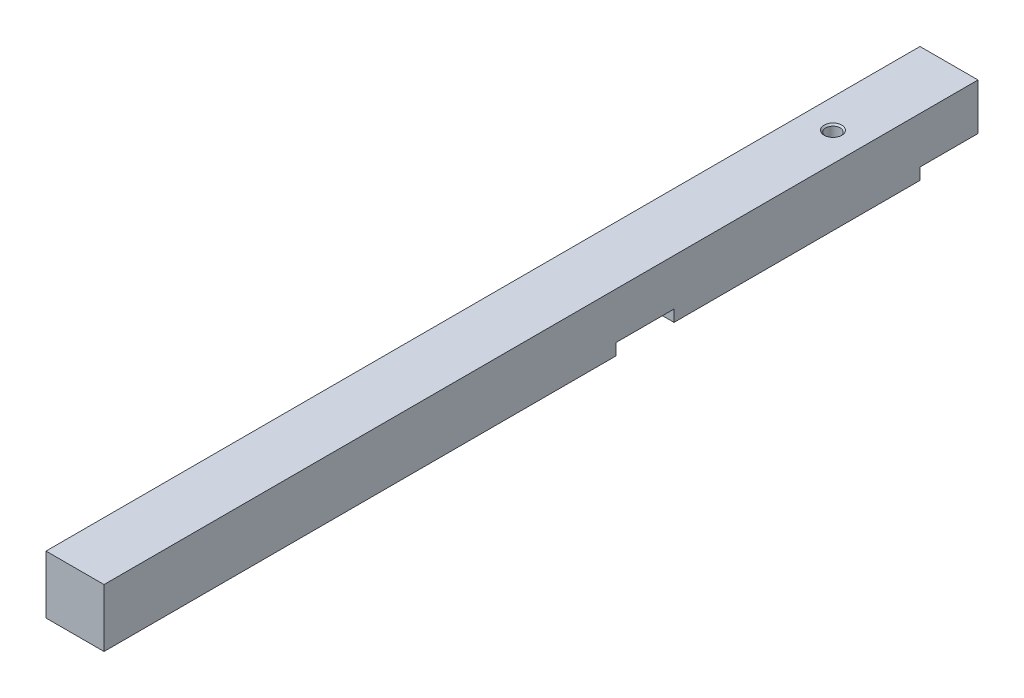
ISO-10303-21;
HEADER;
FILE_DESCRIPTION(('STEP AP214'),'2;1');
FILE_NAME('part.step','',(''),(''),'','','');
FILE_SCHEMA(('AUTOMOTIVE_DESIGN { 1 0 10303 214 1 1 1 1 }'));
ENDSEC;
DATA;
#1=APPLICATION_CONTEXT('core data for automotive mechanical design processes');
#2=APPLICATION_PROTOCOL_DEFINITION('international standard','automotive_design',2000,#1);
#3=PRODUCT_CONTEXT('',#1,'mechanical');
#4=PRODUCT('Part','Part','',(#3));
#5=PRODUCT_RELATED_PRODUCT_CATEGORY('part','',(#4));
#6=PRODUCT_DEFINITION_FORMATION('','',#4);
#7=PRODUCT_DEFINITION_CONTEXT('part definition',#1,'design');
#8=PRODUCT_DEFINITION('design','',#6,#7);
#9=PRODUCT_DEFINITION_SHAPE('','',#8);
#10=(LENGTH_UNIT() NAMED_UNIT(*) SI_UNIT(.MILLI.,.METRE.));
#11=(NAMED_UNIT(*) PLANE_ANGLE_UNIT() SI_UNIT($,.RADIAN.));
#12=(NAMED_UNIT(*) SI_UNIT($,.STERADIAN.) SOLID_ANGLE_UNIT());
#13=UNCERTAINTY_MEASURE_WITH_UNIT(LENGTH_MEASURE(1.E-05),#10,'distance_accuracy_value','');
#14=(GEOMETRIC_REPRESENTATION_CONTEXT(3) GLOBAL_UNCERTAINTY_ASSIGNED_CONTEXT((#13)) GLOBAL_UNIT_ASSIGNED_CONTEXT((#10,
#11,#12)) REPRESENTATION_CONTEXT('',''));
#15=CARTESIAN_POINT('',(0.,0.,0.));
#16=DIRECTION('',(0.,0.,1.));
#17=DIRECTION('',(1.,0.,0.));
#18=AXIS2_PLACEMENT_3D('',#15,#16,#17);
#19=CARTESIAN_POINT('',(-5.,-5.,164.807016268671));
#20=DIRECTION('',(0.,1.,0.));
#21=DIRECTION('',(0.,0.,1.));
#22=AXIS2_PLACEMENT_3D('',#19,#20,#21);
#23=PLANE('',#22);
#24=CARTESIAN_POINT('',(0.,-5.00000000000002,20.));
#25=DIRECTION('',(0.,1.,0.));
#26=DIRECTION('',(0.,0.,1.));
#27=AXIS2_PLACEMENT_3D('',#24,#25,#26);
#28=CIRCLE('',#27,1.25);
#29=CARTESIAN_POINT('',(0.,-5.00000000000002,21.25));
#30=VERTEX_POINT('',#29);
#31=EDGE_CURVE('E190',#30,#30,#28,.T.);
#32=ORIENTED_EDGE('',*,*,#31,.T.);
#33=EDGE_LOOP('',(#32));
#34=FACE_BOUND('',#33,.T.);
#35=DIRECTION('',(0.,0.,-1.));
#36=VECTOR('',#35,1.);
#37=CARTESIAN_POINT('',(5.,-5.,164.807016268671));
#38=LINE('',#37,#36);
#39=CARTESIAN_POINT('',(5.,-5.,52.3999999999999));
#40=VERTEX_POINT('',#39);
#41=CARTESIAN_POINT('',(5.,-5.,10.));
#42=VERTEX_POINT('',#41);
#43=EDGE_CURVE('E128',#40,#42,#38,.T.);
#44=ORIENTED_EDGE('',*,*,#43,.F.);
#45=DIRECTION('',(-1.,0.,0.));
#46=VECTOR('',#45,1.);
#47=CARTESIAN_POINT('',(5.,-5.,52.3999999999999));
#48=LINE('',#47,#46);
#49=CARTESIAN_POINT('',(-5.,-5.00000000000001,52.3999999999999));
#50=VERTEX_POINT('',#49);
#51=EDGE_CURVE('E114',#40,#50,#48,.T.);
#52=ORIENTED_EDGE('',*,*,#51,.T.);
#53=DIRECTION('',(0.,0.,-1.));
#54=VECTOR('',#53,1.);
#55=CARTESIAN_POINT('',(-5.,-5.,164.807016268671));
#56=LINE('',#55,#54);
#57=CARTESIAN_POINT('',(-5.,-5.00000000000001,10.));
#58=VERTEX_POINT('',#57);
#59=EDGE_CURVE('E143',#50,#58,#56,.T.);
#60=ORIENTED_EDGE('',*,*,#59,.T.);
#61=DIRECTION('',(-1.,0.,0.));
#62=VECTOR('',#61,1.);
#63=CARTESIAN_POINT('',(5.,-5.,10.));
#64=LINE('',#63,#62);
#65=EDGE_CURVE('E136',#42,#58,#64,.T.);
#66=ORIENTED_EDGE('',*,*,#65,.F.);
#67=EDGE_LOOP('',(#44,#52,#60,#66));
#68=FACE_BOUND('',#67,.T.);
#69=ADVANCED_FACE('F35',(#34,#68),#23,.F.);
#70=CARTESIAN_POINT('',(-5.,5.,164.807016268671));
#71=DIRECTION('',(1.,0.,0.));
#72=DIRECTION('',(0.,1.,0.));
#73=AXIS2_PLACEMENT_3D('',#70,#71,#72);
#74=PLANE('',#73);
#75=ORIENTED_EDGE('',*,*,#59,.F.);
#76=DIRECTION('',(0.,-1.,0.));
#77=VECTOR('',#76,1.);
#78=CARTESIAN_POINT('',(-5.,-5.00000000000001,52.3999999999999));
#79=LINE('',#78,#77);
#80=CARTESIAN_POINT('',(-5.,-3.,52.3999999999999));
#81=VERTEX_POINT('',#80);
#82=EDGE_CURVE('E119',#81,#50,#79,.T.);
#83=ORIENTED_EDGE('',*,*,#82,.F.);
#84=DIRECTION('',(0.,0.,-1.));
#85=VECTOR('',#84,1.);
#86=CARTESIAN_POINT('',(-5.,-3.,52.3999999999999));
#87=LINE('',#86,#85);
#88=CARTESIAN_POINT('',(-5.,-3.,62.4));
#89=VERTEX_POINT('',#88);
#90=EDGE_CURVE('E132',#89,#81,#87,.T.);
#91=ORIENTED_EDGE('',*,*,#90,.F.);
#92=DIRECTION('',(0.,1.,0.));
#93=VECTOR('',#92,1.);
#94=CARTESIAN_POINT('',(-5.,-5.00000000000001,62.4));
#95=LINE('',#94,#93);
#96=CARTESIAN_POINT('',(-5.,-5.00000000000001,62.4));
#97=VERTEX_POINT('',#96);
#98=EDGE_CURVE('E179',#97,#89,#95,.T.);
#99=ORIENTED_EDGE('',*,*,#98,.F.);
#100=CARTESIAN_POINT('',(-5.,-5.,150.66488064494));
#101=VERTEX_POINT('',#100);
#102=EDGE_CURVE('E138',#101,#97,#56,.T.);
#103=ORIENTED_EDGE('',*,*,#102,.F.);
#104=DIRECTION('',(0.,-1.,0.));
#105=VECTOR('',#104,1.);
#106=CARTESIAN_POINT('',(-5.,5.,150.66488064494));
#107=LINE('',#106,#105);
#108=CARTESIAN_POINT('',(-5.,5.,150.66488064494));
#109=VERTEX_POINT('',#108);
#110=EDGE_CURVE('E165',#109,#101,#107,.T.);
#111=ORIENTED_EDGE('',*,*,#110,.F.);
#112=DIRECTION('',(0.,0.,-1.));
#113=VECTOR('',#112,1.);
#114=CARTESIAN_POINT('',(-5.,5.,164.807016268671));
#115=LINE('',#114,#113);
#116=CARTESIAN_POINT('',(-5.,5.,0.));
#117=VERTEX_POINT('',#116);
#118=EDGE_CURVE('E39',#109,#117,#115,.T.);
#119=ORIENTED_EDGE('',*,*,#118,.T.);
#120=DIRECTION('',(0.,-1.,0.));
#121=VECTOR('',#120,1.);
#122=CARTESIAN_POINT('',(-5.,5.,0.));
#123=LINE('',#122,#121);
#124=CARTESIAN_POINT('',(-5.,-3.,0.));
#125=VERTEX_POINT('',#124);
#126=EDGE_CURVE('E160',#117,#125,#123,.T.);
#127=ORIENTED_EDGE('',*,*,#126,.T.);
#128=DIRECTION('',(0.,0.,-1.));
#129=VECTOR('',#128,1.);
#130=CARTESIAN_POINT('',(-5.,-3.,0.));
#131=LINE('',#130,#129);
#132=CARTESIAN_POINT('',(-5.,-3.,10.));
#133=VERTEX_POINT('',#132);
#134=EDGE_CURVE('E60',#133,#125,#131,.T.);
#135=ORIENTED_EDGE('',*,*,#134,.F.);
#136=DIRECTION('',(0.,1.,0.));
#137=VECTOR('',#136,1.);
#138=CARTESIAN_POINT('',(-5.,-5.00000000000001,10.));
#139=LINE('',#138,#137);
#140=EDGE_CURVE('E196',#58,#133,#139,.T.);
#141=ORIENTED_EDGE('',*,*,#140,.F.);
#142=EDGE_LOOP('',(#75,#83,#91,#99,#103,#111,#119,#127,#135,#141));
#143=FACE_BOUND('',#142,.T.);
#144=ADVANCED_FACE('F175',(#143),#74,.F.);
#145=ORIENTED_EDGE('',*,*,#102,.T.);
#146=DIRECTION('',(-1.,0.,0.));
#147=VECTOR('',#146,1.);
#148=CARTESIAN_POINT('',(5.,-5.,62.4));
#149=LINE('',#148,#147);
#150=CARTESIAN_POINT('',(5.,-5.,62.4));
#151=VERTEX_POINT('',#150);
#152=EDGE_CURVE('E123',#151,#97,#149,.T.);
#153=ORIENTED_EDGE('',*,*,#152,.F.);
#154=CARTESIAN_POINT('',(5.,-5.,150.66488064494));
#155=VERTEX_POINT('',#154);
#156=EDGE_CURVE('E137',#155,#151,#38,.T.);
#157=ORIENTED_EDGE('',*,*,#156,.F.);
#158=DIRECTION('',(1.,0.,0.));
#159=VECTOR('',#158,1.);
#160=CARTESIAN_POINT('',(-5.,-5.,150.66488064494));
#161=LINE('',#160,#159);
#162=EDGE_CURVE('E44',#101,#155,#161,.T.);
#163=ORIENTED_EDGE('',*,*,#162,.F.);
#164=EDGE_LOOP('',(#145,#153,#157,#163));
#165=FACE_BOUND('',#164,.T.);
#166=ADVANCED_FACE('F182',(#165),#23,.F.);
#167=CARTESIAN_POINT('',(5.,5.,164.807016268671));
#168=DIRECTION('',(-1.,0.,0.));
#169=DIRECTION('',(0.,-1.,0.));
#170=AXIS2_PLACEMENT_3D('',#167,#168,#169);
#171=PLANE('',#170);
#172=DIRECTION('',(0.,0.,-1.));
#173=VECTOR('',#172,1.);
#174=CARTESIAN_POINT('',(5.,-3.,52.3999999999999));
#175=LINE('',#174,#173);
#176=CARTESIAN_POINT('',(5.,-3.,62.4));
#177=VERTEX_POINT('',#176);
#178=CARTESIAN_POINT('',(5.,-3.,52.3999999999999));
#179=VERTEX_POINT('',#178);
#180=EDGE_CURVE('E52',#177,#179,#175,.T.);
#181=ORIENTED_EDGE('',*,*,#180,.T.);
#182=DIRECTION('',(0.,-1.,0.));
#183=VECTOR('',#182,1.);
#184=CARTESIAN_POINT('',(5.,-5.,52.3999999999999));
#185=LINE('',#184,#183);
#186=EDGE_CURVE('E117',#179,#40,#185,.T.);
#187=ORIENTED_EDGE('',*,*,#186,.T.);
#188=ORIENTED_EDGE('',*,*,#43,.T.);
#189=DIRECTION('',(0.,1.,0.));
#190=VECTOR('',#189,1.);
#191=CARTESIAN_POINT('',(5.,-5.,10.));
#192=LINE('',#191,#190);
#193=CARTESIAN_POINT('',(5.,-3.,10.));
#194=VERTEX_POINT('',#193);
#195=EDGE_CURVE('E200',#42,#194,#192,.T.);
#196=ORIENTED_EDGE('',*,*,#195,.T.);
#197=DIRECTION('',(0.,0.,-1.));
#198=VECTOR('',#197,1.);
#199=CARTESIAN_POINT('',(5.,-3.,0.));
#200=LINE('',#199,#198);
#201=CARTESIAN_POINT('',(5.,-3.,0.));
#202=VERTEX_POINT('',#201);
#203=EDGE_CURVE('E202',#194,#202,#200,.T.);
#204=ORIENTED_EDGE('',*,*,#203,.T.);
#205=DIRECTION('',(0.,1.,0.));
#206=VECTOR('',#205,1.);
#207=CARTESIAN_POINT('',(5.,5.,0.));
#208=LINE('',#207,#206);
#209=CARTESIAN_POINT('',(5.,5.,0.));
#210=VERTEX_POINT('',#209);
#211=EDGE_CURVE('E141',#202,#210,#208,.T.);
#212=ORIENTED_EDGE('',*,*,#211,.T.);
#213=DIRECTION('',(0.,0.,-1.));
#214=VECTOR('',#213,1.);
#215=CARTESIAN_POINT('',(5.,5.,164.807016268671));
#216=LINE('',#215,#214);
#217=CARTESIAN_POINT('',(5.,5.,150.66488064494));
#218=VERTEX_POINT('',#217);
#219=EDGE_CURVE('E146',#218,#210,#216,.T.);
#220=ORIENTED_EDGE('',*,*,#219,.F.);
#221=DIRECTION('',(0.,1.,0.));
#222=VECTOR('',#221,1.);
#223=CARTESIAN_POINT('',(5.,5.,150.66488064494));
#224=LINE('',#223,#222);
#225=EDGE_CURVE('E11',#155,#218,#224,.T.);
#226=ORIENTED_EDGE('',*,*,#225,.F.);
#227=ORIENTED_EDGE('',*,*,#156,.T.);
#228=DIRECTION('',(0.,1.,0.));
#229=VECTOR('',#228,1.);
#230=CARTESIAN_POINT('',(5.,-5.,62.4));
#231=LINE('',#230,#229);
#232=EDGE_CURVE('E131',#151,#177,#231,.T.);
#233=ORIENTED_EDGE('',*,*,#232,.T.);
#234=EDGE_LOOP('',(#181,#187,#188,#196,#204,#212,#220,#226,#227,#233));
#235=FACE_BOUND('',#234,.T.);
#236=ADVANCED_FACE('F126',(#235),#171,.F.);
#237=CARTESIAN_POINT('',(-5.,5.,164.807016268671));
#238=DIRECTION('',(0.,-1.,0.));
#239=DIRECTION('',(0.,0.,-1.));
#240=AXIS2_PLACEMENT_3D('',#237,#238,#239);
#241=PLANE('',#240);
#242=CARTESIAN_POINT('',(0.,5.,20.));
#243=DIRECTION('',(0.,1.,0.));
#244=DIRECTION('',(0.,0.,1.));
#245=AXIS2_PLACEMENT_3D('',#242,#243,#244);
#246=CIRCLE('',#245,1.525);
#247=CARTESIAN_POINT('',(0.,5.,21.525));
#248=VERTEX_POINT('',#247);
#249=EDGE_CURVE('E342',#248,#248,#246,.T.);
#250=ORIENTED_EDGE('',*,*,#249,.F.);
#251=EDGE_LOOP('',(#250));
#252=FACE_BOUND('',#251,.T.);
#253=DIRECTION('',(-1.,0.,0.));
#254=VECTOR('',#253,1.);
#255=CARTESIAN_POINT('',(-5.,5.,150.66488064494));
#256=LINE('',#255,#254);
#257=EDGE_CURVE('E153',#218,#109,#256,.T.);
#258=ORIENTED_EDGE('',*,*,#257,.F.);
#259=ORIENTED_EDGE('',*,*,#219,.T.);
#260=DIRECTION('',(-1.,0.,0.));
#261=VECTOR('',#260,1.);
#262=CARTESIAN_POINT('',(-5.,5.,0.));
#263=LINE('',#262,#261);
#264=EDGE_CURVE('E148',#210,#117,#263,.T.);
#265=ORIENTED_EDGE('',*,*,#264,.T.);
#266=ORIENTED_EDGE('',*,*,#118,.F.);
#267=EDGE_LOOP('',(#258,#259,#265,#266));
#268=FACE_BOUND('',#267,.T.);
#269=ADVANCED_FACE('F170',(#252,#268),#241,.F.);
#270=CARTESIAN_POINT('',(0.,0.,0.));
#271=DIRECTION('',(0.,0.,1.));
#272=DIRECTION('',(1.,0.,0.));
#273=AXIS2_PLACEMENT_3D('',#270,#271,#272);
#274=PLANE('',#273);
#275=ORIENTED_EDGE('',*,*,#211,.F.);
#276=DIRECTION('',(-1.,0.,0.));
#277=VECTOR('',#276,1.);
#278=CARTESIAN_POINT('',(5.,-3.,0.));
#279=LINE('',#278,#277);
#280=EDGE_CURVE('E173',#202,#125,#279,.T.);
#281=ORIENTED_EDGE('',*,*,#280,.T.);
#282=ORIENTED_EDGE('',*,*,#126,.F.);
#283=ORIENTED_EDGE('',*,*,#264,.F.);
#284=EDGE_LOOP('',(#275,#281,#282,#283));
#285=FACE_BOUND('',#284,.T.);
#286=ADVANCED_FACE('F213',(#285),#274,.F.);
#287=CARTESIAN_POINT('',(1.94289029309402E-13,5.00000000000001,150.66488064494));
#288=DIRECTION('',(0.,0.,1.));
#289=DIRECTION('',(1.,0.,0.));
#290=AXIS2_PLACEMENT_3D('',#287,#288,#289);
#291=PLANE('',#290);
#292=ORIENTED_EDGE('',*,*,#257,.T.);
#293=ORIENTED_EDGE('',*,*,#110,.T.);
#294=ORIENTED_EDGE('',*,*,#162,.T.);
#295=ORIENTED_EDGE('',*,*,#225,.T.);
#296=EDGE_LOOP('',(#292,#293,#294,#295));
#297=FACE_BOUND('',#296,.T.);
#298=ADVANCED_FACE('F37',(#297),#291,.T.);
#299=CARTESIAN_POINT('',(5.,-3.,0.));
#300=DIRECTION('',(0.,1.,0.));
#301=DIRECTION('',(-1.,0.,0.));
#302=AXIS2_PLACEMENT_3D('',#299,#300,#301);
#303=PLANE('',#302);
#304=ORIENTED_EDGE('',*,*,#134,.T.);
#305=ORIENTED_EDGE('',*,*,#280,.F.);
#306=ORIENTED_EDGE('',*,*,#203,.F.);
#307=DIRECTION('',(-1.,0.,0.));
#308=VECTOR('',#307,1.);
#309=CARTESIAN_POINT('',(5.,-3.,10.));
#310=LINE('',#309,#308);
#311=EDGE_CURVE('E208',#194,#133,#310,.T.);
#312=ORIENTED_EDGE('',*,*,#311,.T.);
#313=EDGE_LOOP('',(#304,#305,#306,#312));
#314=FACE_BOUND('',#313,.T.);
#315=ADVANCED_FACE('F215',(#314),#303,.F.);
#316=CARTESIAN_POINT('',(5.,-5.,10.));
#317=DIRECTION('',(0.,0.,1.));
#318=DIRECTION('',(1.,0.,0.));
#319=AXIS2_PLACEMENT_3D('',#316,#317,#318);
#320=PLANE('',#319);
#321=ORIENTED_EDGE('',*,*,#140,.T.);
#322=ORIENTED_EDGE('',*,*,#311,.F.);
#323=ORIENTED_EDGE('',*,*,#195,.F.);
#324=ORIENTED_EDGE('',*,*,#65,.T.);
#325=EDGE_LOOP('',(#321,#322,#323,#324));
#326=FACE_BOUND('',#325,.T.);
#327=ADVANCED_FACE('F211',(#326),#320,.F.);
#328=CARTESIAN_POINT('',(5.,-5.,52.3999999999999));
#329=DIRECTION('',(0.,0.,-1.));
#330=DIRECTION('',(-1.,0.,0.));
#331=AXIS2_PLACEMENT_3D('',#328,#329,#330);
#332=PLANE('',#331);
#333=ORIENTED_EDGE('',*,*,#82,.T.);
#334=ORIENTED_EDGE('',*,*,#51,.F.);
#335=ORIENTED_EDGE('',*,*,#186,.F.);
#336=DIRECTION('',(-1.,0.,0.));
#337=VECTOR('',#336,1.);
#338=CARTESIAN_POINT('',(5.,-3.,52.3999999999999));
#339=LINE('',#338,#337);
#340=EDGE_CURVE('E194',#179,#81,#339,.T.);
#341=ORIENTED_EDGE('',*,*,#340,.T.);
#342=EDGE_LOOP('',(#333,#334,#335,#341));
#343=FACE_BOUND('',#342,.T.);
#344=ADVANCED_FACE('F116',(#343),#332,.F.);
#345=CARTESIAN_POINT('',(5.,-3.,52.3999999999999));
#346=DIRECTION('',(0.,1.,0.));
#347=DIRECTION('',(-1.,0.,0.));
#348=AXIS2_PLACEMENT_3D('',#345,#346,#347);
#349=PLANE('',#348);
#350=ORIENTED_EDGE('',*,*,#90,.T.);
#351=ORIENTED_EDGE('',*,*,#340,.F.);
#352=ORIENTED_EDGE('',*,*,#180,.F.);
#353=DIRECTION('',(-1.,0.,0.));
#354=VECTOR('',#353,1.);
#355=CARTESIAN_POINT('',(5.,-3.,62.4));
#356=LINE('',#355,#354);
#357=EDGE_CURVE('E197',#177,#89,#356,.T.);
#358=ORIENTED_EDGE('',*,*,#357,.T.);
#359=EDGE_LOOP('',(#350,#351,#352,#358));
#360=FACE_BOUND('',#359,.T.);
#361=ADVANCED_FACE('F305',(#360),#349,.F.);
#362=CARTESIAN_POINT('',(5.,-5.,62.4));
#363=DIRECTION('',(0.,0.,1.));
#364=DIRECTION('',(1.,0.,0.));
#365=AXIS2_PLACEMENT_3D('',#362,#363,#364);
#366=PLANE('',#365);
#367=ORIENTED_EDGE('',*,*,#98,.T.);
#368=ORIENTED_EDGE('',*,*,#357,.F.);
#369=ORIENTED_EDGE('',*,*,#232,.F.);
#370=ORIENTED_EDGE('',*,*,#152,.T.);
#371=EDGE_LOOP('',(#367,#368,#369,#370));
#372=FACE_BOUND('',#371,.T.);
#373=ADVANCED_FACE('F286',(#372),#366,.F.);
#374=CARTESIAN_POINT('',(0.,5.,20.));
#375=DIRECTION('',(0.,1.,0.));
#376=DIRECTION('',(0.,0.,1.));
#377=AXIS2_PLACEMENT_3D('',#374,#375,#376);
#378=CYLINDRICAL_SURFACE('',#377,1.24999999999999);
#379=ORIENTED_EDGE('',*,*,#31,.F.);
#380=EDGE_LOOP('',(#379));
#381=FACE_BOUND('',#380,.T.);
#382=CARTESIAN_POINT('',(0.,4.72499999999999,20.));
#383=DIRECTION('',(0.,1.,0.));
#384=DIRECTION('',(0.,0.,1.));
#385=AXIS2_PLACEMENT_3D('',#382,#383,#384);
#386=CIRCLE('',#385,1.24999999999999);
#387=CARTESIAN_POINT('',(0.,4.72499999999999,21.25));
#388=VERTEX_POINT('',#387);
#389=EDGE_CURVE('E339',#388,#388,#386,.T.);
#390=ORIENTED_EDGE('',*,*,#389,.T.);
#391=EDGE_LOOP('',(#390));
#392=FACE_BOUND('',#391,.T.);
#393=ADVANCED_FACE('F279',(#381,#392),#378,.F.);
#394=CARTESIAN_POINT('',(0.,5.,20.));
#395=DIRECTION('',(0.,1.,0.));
#396=DIRECTION('',(0.,0.,1.));
#397=AXIS2_PLACEMENT_3D('',#394,#395,#396);
#398=CONICAL_SURFACE('',#397,1.525,0.785398163397448);
#399=ORIENTED_EDGE('',*,*,#389,.F.);
#400=EDGE_LOOP('',(#399));
#401=FACE_BOUND('',#400,.T.);
#402=ORIENTED_EDGE('',*,*,#249,.T.);
#403=EDGE_LOOP('',(#402));
#404=FACE_BOUND('',#403,.T.);
#405=ADVANCED_FACE('F285',(#401,#404),#398,.F.);
#406=CLOSED_SHELL('',(#69,#144,#166,#236,#269,#286,#298,#315,#327,#344,#361,#373,#393,#405));
#407=MANIFOLD_SOLID_BREP('B2',#406);
#408=ADVANCED_BREP_SHAPE_REPRESENTATION('',(#18,#407),#14);
#409=SHAPE_DEFINITION_REPRESENTATION(#9,#408);
ENDSEC;
END-ISO-10303-21;
